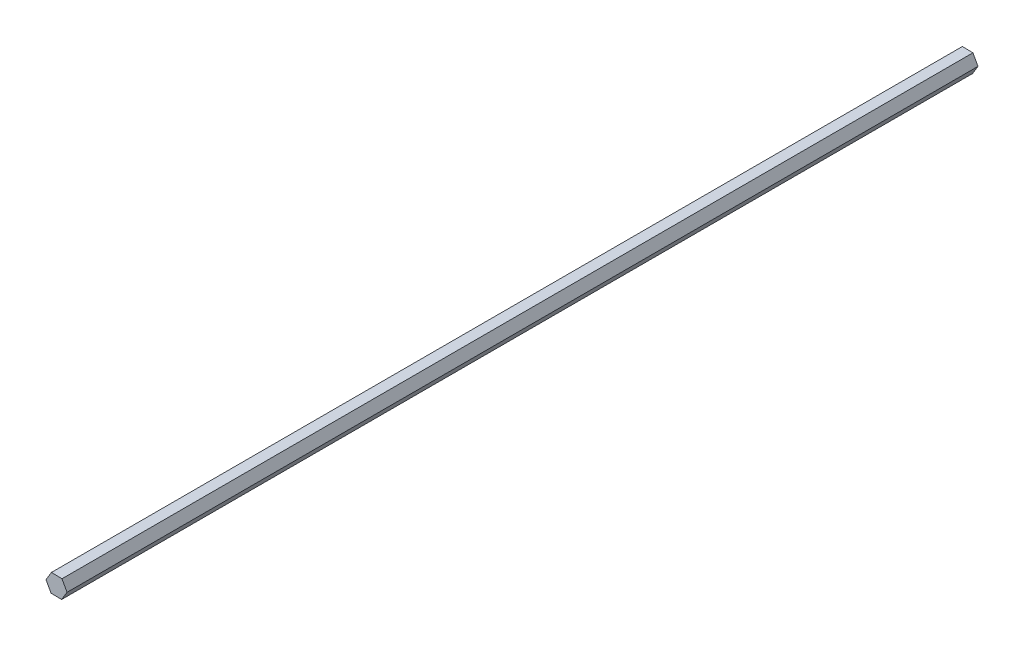
ISO-10303-21;
HEADER;
FILE_DESCRIPTION(('STEP AP214'),'2;1');
FILE_NAME('part.step','',(''),(''),'','','');
FILE_SCHEMA(('AUTOMOTIVE_DESIGN { 1 0 10303 214 1 1 1 1 }'));
ENDSEC;
DATA;
#1=APPLICATION_CONTEXT('core data for automotive mechanical design processes');
#2=APPLICATION_PROTOCOL_DEFINITION('international standard','automotive_design',2000,#1);
#3=PRODUCT_CONTEXT('',#1,'mechanical');
#4=PRODUCT('Part','Part','',(#3));
#5=PRODUCT_RELATED_PRODUCT_CATEGORY('part','',(#4));
#6=PRODUCT_DEFINITION_FORMATION('','',#4);
#7=PRODUCT_DEFINITION_CONTEXT('part definition',#1,'design');
#8=PRODUCT_DEFINITION('design','',#6,#7);
#9=PRODUCT_DEFINITION_SHAPE('','',#8);
#10=(LENGTH_UNIT() NAMED_UNIT(*) SI_UNIT(.MILLI.,.METRE.));
#11=(NAMED_UNIT(*) PLANE_ANGLE_UNIT() SI_UNIT($,.RADIAN.));
#12=(NAMED_UNIT(*) SI_UNIT($,.STERADIAN.) SOLID_ANGLE_UNIT());
#13=UNCERTAINTY_MEASURE_WITH_UNIT(LENGTH_MEASURE(1.E-05),#10,'distance_accuracy_value','');
#14=(GEOMETRIC_REPRESENTATION_CONTEXT(3) GLOBAL_UNCERTAINTY_ASSIGNED_CONTEXT((#13)) GLOBAL_UNIT_ASSIGNED_CONTEXT((#10,
#11,#12)) REPRESENTATION_CONTEXT('',''));
#15=CARTESIAN_POINT('',(0.,0.,0.));
#16=DIRECTION('',(0.,0.,1.));
#17=DIRECTION('',(1.,0.,0.));
#18=AXIS2_PLACEMENT_3D('',#15,#16,#17);
#19=CARTESIAN_POINT('',(-3.80792316913091,-6.26602381669024,635.));
#20=DIRECTION('',(0.0224684210806521,0.999747553162368,0.));
#21=DIRECTION('',(-0.999747553162368,0.0224684210806521,0.));
#22=AXIS2_PLACEMENT_3D('',#19,#20,#21);
#23=PLANE('',#22);
#24=DIRECTION('',(0.999747553162368,-0.0224684210806521,0.));
#25=VECTOR('',#24,1.);
#26=CARTESIAN_POINT('',(-3.80792316913091,-6.26602381669024,0.));
#27=LINE('',#26,#25);
#28=CARTESIAN_POINT('',(-3.80792316913091,-6.26602381669024,0.));
#29=VERTEX_POINT('',#28);
#30=CARTESIAN_POINT('',(3.52257422140663,-6.43077010847183,0.));
#31=VERTEX_POINT('',#30);
#32=EDGE_CURVE('E121',#29,#31,#27,.T.);
#33=ORIENTED_EDGE('',*,*,#32,.T.);
#34=DIRECTION('',(0.,0.,-1.));
#35=VECTOR('',#34,1.);
#36=CARTESIAN_POINT('',(3.52257422140663,-6.43077010847183,635.));
#37=LINE('',#36,#35);
#38=CARTESIAN_POINT('',(3.52257422140663,-6.43077010847183,635.));
#39=VERTEX_POINT('',#38);
#40=EDGE_CURVE('E11',#39,#31,#37,.T.);
#41=ORIENTED_EDGE('',*,*,#40,.F.);
#42=DIRECTION('',(0.999747553162368,-0.0224684210806521,0.));
#43=VECTOR('',#42,1.);
#44=CARTESIAN_POINT('',(-3.80792316913091,-6.26602381669024,635.));
#45=LINE('',#44,#43);
#46=CARTESIAN_POINT('',(-3.80792316913091,-6.26602381669024,635.));
#47=VERTEX_POINT('',#46);
#48=EDGE_CURVE('E131',#47,#39,#45,.T.);
#49=ORIENTED_EDGE('',*,*,#48,.F.);
#50=DIRECTION('',(0.,0.,-1.));
#51=VECTOR('',#50,1.);
#52=CARTESIAN_POINT('',(-3.80792316913091,-6.26602381669024,635.));
#53=LINE('',#52,#51);
#54=EDGE_CURVE('E117',#47,#29,#53,.T.);
#55=ORIENTED_EDGE('',*,*,#54,.T.);
#56=EDGE_LOOP('',(#33,#41,#49,#55));
#57=FACE_BOUND('',#56,.T.);
#58=ADVANCED_FACE('F37',(#57),#23,.F.);
#59=CARTESIAN_POINT('',(3.52257422140663,-6.43077010847183,635.));
#60=DIRECTION('',(-0.854572567869619,0.519332000019954,0.));
#61=DIRECTION('',(-0.519332000019954,-0.854572567869619,0.));
#62=AXIS2_PLACEMENT_3D('',#59,#60,#61);
#63=PLANE('',#62);
#64=DIRECTION('',(0.519332000019954,0.854572567869619,0.));
#65=VECTOR('',#64,1.);
#66=CARTESIAN_POINT('',(3.52257422140663,-6.43077010847183,0.));
#67=LINE('',#66,#65);
#68=CARTESIAN_POINT('',(7.33049739053753,-0.164746291781588,0.));
#69=VERTEX_POINT('',#68);
#70=EDGE_CURVE('E124',#31,#69,#67,.T.);
#71=ORIENTED_EDGE('',*,*,#70,.T.);
#72=DIRECTION('',(0.,0.,-1.));
#73=VECTOR('',#72,1.);
#74=CARTESIAN_POINT('',(7.33049739053753,-0.164746291781588,635.));
#75=LINE('',#74,#73);
#76=CARTESIAN_POINT('',(7.33049739053753,-0.164746291781588,635.));
#77=VERTEX_POINT('',#76);
#78=EDGE_CURVE('E45',#77,#69,#75,.T.);
#79=ORIENTED_EDGE('',*,*,#78,.F.);
#80=DIRECTION('',(0.519332000019954,0.854572567869619,0.));
#81=VECTOR('',#80,1.);
#82=CARTESIAN_POINT('',(3.52257422140663,-6.43077010847183,635.));
#83=LINE('',#82,#81);
#84=EDGE_CURVE('E90',#39,#77,#83,.T.);
#85=ORIENTED_EDGE('',*,*,#84,.F.);
#86=ORIENTED_EDGE('',*,*,#40,.T.);
#87=EDGE_LOOP('',(#71,#79,#85,#86));
#88=FACE_BOUND('',#87,.T.);
#89=ADVANCED_FACE('F155',(#88),#63,.F.);
#90=CARTESIAN_POINT('',(7.33049739053753,-0.164746291781588,635.));
#91=DIRECTION('',(-0.87704098895027,-0.480415553142414,0.));
#92=DIRECTION('',(0.480415553142414,-0.87704098895027,0.));
#93=AXIS2_PLACEMENT_3D('',#90,#91,#92);
#94=PLANE('',#93);
#95=DIRECTION('',(-0.480415553142414,0.877040988950271,0.));
#96=VECTOR('',#95,1.);
#97=CARTESIAN_POINT('',(7.33049739053753,-0.164746291781588,0.));
#98=LINE('',#97,#96);
#99=CARTESIAN_POINT('',(3.8079231691309,6.26602381669024,0.));
#100=VERTEX_POINT('',#99);
#101=EDGE_CURVE('E126',#69,#100,#98,.T.);
#102=ORIENTED_EDGE('',*,*,#101,.T.);
#103=DIRECTION('',(0.,0.,-1.));
#104=VECTOR('',#103,1.);
#105=CARTESIAN_POINT('',(3.8079231691309,6.26602381669024,635.));
#106=LINE('',#105,#104);
#107=CARTESIAN_POINT('',(3.8079231691309,6.26602381669024,635.));
#108=VERTEX_POINT('',#107);
#109=EDGE_CURVE('E112',#108,#100,#106,.T.);
#110=ORIENTED_EDGE('',*,*,#109,.F.);
#111=DIRECTION('',(-0.480415553142414,0.877040988950271,0.));
#112=VECTOR('',#111,1.);
#113=CARTESIAN_POINT('',(7.33049739053753,-0.164746291781588,635.));
#114=LINE('',#113,#112);
#115=EDGE_CURVE('E103',#77,#108,#114,.T.);
#116=ORIENTED_EDGE('',*,*,#115,.F.);
#117=ORIENTED_EDGE('',*,*,#78,.T.);
#118=EDGE_LOOP('',(#102,#110,#116,#117));
#119=FACE_BOUND('',#118,.T.);
#120=ADVANCED_FACE('F137',(#119),#94,.F.);
#121=CARTESIAN_POINT('',(3.8079231691309,6.26602381669024,635.));
#122=DIRECTION('',(-0.0224684210806521,-0.999747553162368,0.));
#123=DIRECTION('',(0.999747553162368,-0.0224684210806521,0.));
#124=AXIS2_PLACEMENT_3D('',#121,#122,#123);
#125=PLANE('',#124);
#126=DIRECTION('',(-0.999747553162368,0.0224684210806521,0.));
#127=VECTOR('',#126,1.);
#128=CARTESIAN_POINT('',(3.8079231691309,6.26602381669024,0.));
#129=LINE('',#128,#127);
#130=CARTESIAN_POINT('',(-3.52257422140663,6.43077010847183,0.));
#131=VERTEX_POINT('',#130);
#132=EDGE_CURVE('E111',#100,#131,#129,.T.);
#133=ORIENTED_EDGE('',*,*,#132,.T.);
#134=DIRECTION('',(0.,0.,-1.));
#135=VECTOR('',#134,1.);
#136=CARTESIAN_POINT('',(-3.52257422140663,6.43077010847183,635.));
#137=LINE('',#136,#135);
#138=CARTESIAN_POINT('',(-3.52257422140663,6.43077010847183,635.));
#139=VERTEX_POINT('',#138);
#140=EDGE_CURVE('E108',#139,#131,#137,.T.);
#141=ORIENTED_EDGE('',*,*,#140,.F.);
#142=DIRECTION('',(-0.999747553162368,0.0224684210806521,0.));
#143=VECTOR('',#142,1.);
#144=CARTESIAN_POINT('',(3.8079231691309,6.26602381669024,635.));
#145=LINE('',#144,#143);
#146=EDGE_CURVE('E97',#108,#139,#145,.T.);
#147=ORIENTED_EDGE('',*,*,#146,.F.);
#148=ORIENTED_EDGE('',*,*,#109,.T.);
#149=EDGE_LOOP('',(#133,#141,#147,#148));
#150=FACE_BOUND('',#149,.T.);
#151=ADVANCED_FACE('F109',(#150),#125,.F.);
#152=CARTESIAN_POINT('',(-3.52257422140663,6.43077010847183,635.));
#153=DIRECTION('',(0.854572567869619,-0.519332000019954,0.));
#154=DIRECTION('',(0.519332000019954,0.854572567869619,0.));
#155=AXIS2_PLACEMENT_3D('',#152,#153,#154);
#156=PLANE('',#155);
#157=DIRECTION('',(-0.519332000019954,-0.854572567869619,0.));
#158=VECTOR('',#157,1.);
#159=CARTESIAN_POINT('',(-3.52257422140663,6.43077010847183,0.));
#160=LINE('',#159,#158);
#161=CARTESIAN_POINT('',(-7.33049739053753,0.164746291781587,0.));
#162=VERTEX_POINT('',#161);
#163=EDGE_CURVE('E76',#131,#162,#160,.T.);
#164=ORIENTED_EDGE('',*,*,#163,.T.);
#165=DIRECTION('',(0.,0.,-1.));
#166=VECTOR('',#165,1.);
#167=CARTESIAN_POINT('',(-7.33049739053753,0.164746291781587,635.));
#168=LINE('',#167,#166);
#169=CARTESIAN_POINT('',(-7.33049739053753,0.164746291781587,635.));
#170=VERTEX_POINT('',#169);
#171=EDGE_CURVE('E113',#170,#162,#168,.T.);
#172=ORIENTED_EDGE('',*,*,#171,.F.);
#173=DIRECTION('',(-0.519332000019954,-0.854572567869619,0.));
#174=VECTOR('',#173,1.);
#175=CARTESIAN_POINT('',(-3.52257422140663,6.43077010847183,635.));
#176=LINE('',#175,#174);
#177=EDGE_CURVE('E101',#139,#170,#176,.T.);
#178=ORIENTED_EDGE('',*,*,#177,.F.);
#179=ORIENTED_EDGE('',*,*,#140,.T.);
#180=EDGE_LOOP('',(#164,#172,#178,#179));
#181=FACE_BOUND('',#180,.T.);
#182=ADVANCED_FACE('F115',(#181),#156,.F.);
#183=CARTESIAN_POINT('',(-7.33049739053753,0.164746291781587,635.));
#184=DIRECTION('',(0.87704098895027,0.480415553142414,0.));
#185=DIRECTION('',(-0.480415553142414,0.877040988950271,0.));
#186=AXIS2_PLACEMENT_3D('',#183,#184,#185);
#187=PLANE('',#186);
#188=DIRECTION('',(0.480415553142414,-0.877040988950271,0.));
#189=VECTOR('',#188,1.);
#190=CARTESIAN_POINT('',(-7.33049739053753,0.164746291781587,0.));
#191=LINE('',#190,#189);
#192=EDGE_CURVE('E82',#162,#29,#191,.T.);
#193=ORIENTED_EDGE('',*,*,#192,.T.);
#194=ORIENTED_EDGE('',*,*,#54,.F.);
#195=DIRECTION('',(0.480415553142414,-0.877040988950271,0.));
#196=VECTOR('',#195,1.);
#197=CARTESIAN_POINT('',(-7.33049739053753,0.164746291781587,635.));
#198=LINE('',#197,#196);
#199=EDGE_CURVE('E53',#170,#47,#198,.T.);
#200=ORIENTED_EDGE('',*,*,#199,.F.);
#201=ORIENTED_EDGE('',*,*,#171,.T.);
#202=EDGE_LOOP('',(#193,#194,#200,#201));
#203=FACE_BOUND('',#202,.T.);
#204=ADVANCED_FACE('F144',(#203),#187,.F.);
#205=CARTESIAN_POINT('',(0.,0.,635.));
#206=DIRECTION('',(0.,0.,1.));
#207=DIRECTION('',(1.,0.,0.));
#208=AXIS2_PLACEMENT_3D('',#205,#206,#207);
#209=PLANE('',#208);
#210=ORIENTED_EDGE('',*,*,#48,.T.);
#211=ORIENTED_EDGE('',*,*,#84,.T.);
#212=ORIENTED_EDGE('',*,*,#115,.T.);
#213=ORIENTED_EDGE('',*,*,#146,.T.);
#214=ORIENTED_EDGE('',*,*,#177,.T.);
#215=ORIENTED_EDGE('',*,*,#199,.T.);
#216=EDGE_LOOP('',(#210,#211,#212,#213,#214,#215));
#217=FACE_BOUND('',#216,.T.);
#218=ADVANCED_FACE('F99',(#217),#209,.T.);
#219=CARTESIAN_POINT('',(0.,0.,0.));
#220=DIRECTION('',(0.,0.,1.));
#221=DIRECTION('',(1.,0.,0.));
#222=AXIS2_PLACEMENT_3D('',#219,#220,#221);
#223=PLANE('',#222);
#224=ORIENTED_EDGE('',*,*,#32,.F.);
#225=ORIENTED_EDGE('',*,*,#192,.F.);
#226=ORIENTED_EDGE('',*,*,#163,.F.);
#227=ORIENTED_EDGE('',*,*,#132,.F.);
#228=ORIENTED_EDGE('',*,*,#101,.F.);
#229=ORIENTED_EDGE('',*,*,#70,.F.);
#230=EDGE_LOOP('',(#224,#225,#226,#227,#228,#229));
#231=FACE_BOUND('',#230,.T.);
#232=ADVANCED_FACE('F140',(#231),#223,.F.);
#233=CLOSED_SHELL('',(#58,#89,#120,#151,#182,#204,#218,#232));
#234=MANIFOLD_SOLID_BREP('B2',#233);
#235=ADVANCED_BREP_SHAPE_REPRESENTATION('',(#18,#234),#14);
#236=SHAPE_DEFINITION_REPRESENTATION(#9,#235);
ENDSEC;
END-ISO-10303-21;
